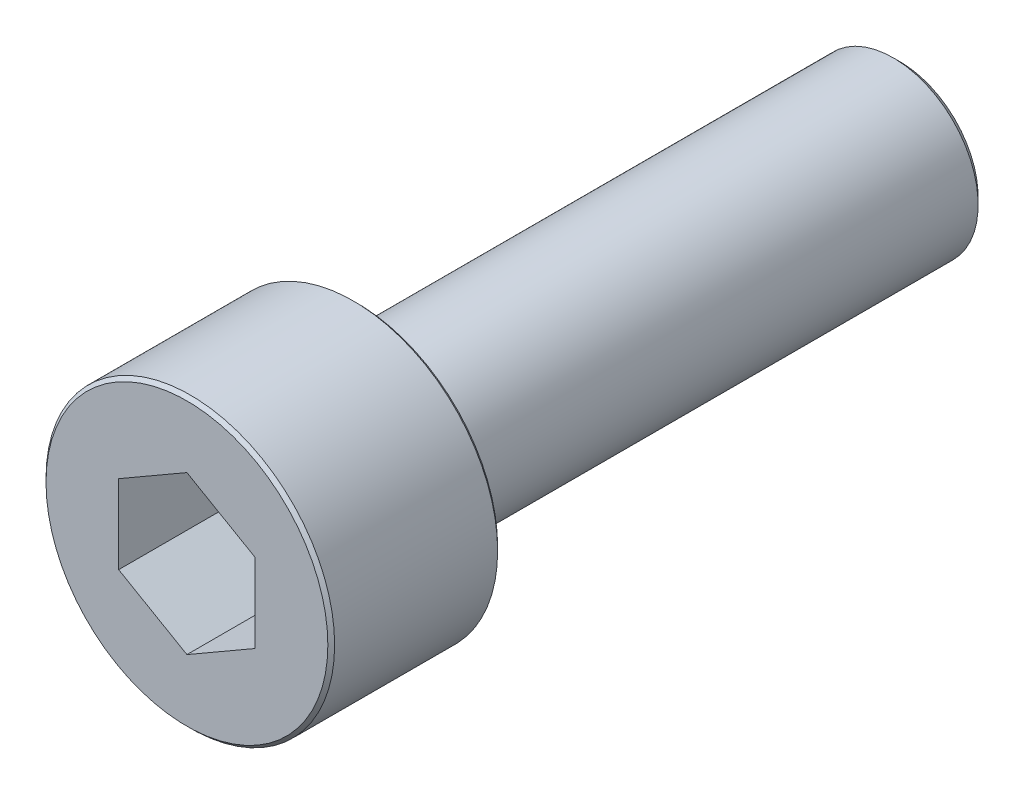
ISO-10303-21;
HEADER;
FILE_DESCRIPTION(('STEP AP214'),'2;1');
FILE_NAME('part.step','',(''),(''),'','','');
FILE_SCHEMA(('AUTOMOTIVE_DESIGN { 1 0 10303 214 1 1 1 1 }'));
ENDSEC;
DATA;
#1=APPLICATION_CONTEXT('core data for automotive mechanical design processes');
#2=APPLICATION_PROTOCOL_DEFINITION('international standard','automotive_design',2000,#1);
#3=PRODUCT_CONTEXT('',#1,'mechanical');
#4=PRODUCT('Part','Part','',(#3));
#5=PRODUCT_RELATED_PRODUCT_CATEGORY('part','',(#4));
#6=PRODUCT_DEFINITION_FORMATION('','',#4);
#7=PRODUCT_DEFINITION_CONTEXT('part definition',#1,'design');
#8=PRODUCT_DEFINITION('design','',#6,#7);
#9=PRODUCT_DEFINITION_SHAPE('','',#8);
#10=(LENGTH_UNIT() NAMED_UNIT(*) SI_UNIT(.MILLI.,.METRE.));
#11=(NAMED_UNIT(*) PLANE_ANGLE_UNIT() SI_UNIT($,.RADIAN.));
#12=(NAMED_UNIT(*) SI_UNIT($,.STERADIAN.) SOLID_ANGLE_UNIT());
#13=UNCERTAINTY_MEASURE_WITH_UNIT(LENGTH_MEASURE(1.E-05),#10,'distance_accuracy_value','');
#14=(GEOMETRIC_REPRESENTATION_CONTEXT(3) GLOBAL_UNCERTAINTY_ASSIGNED_CONTEXT((#13)) GLOBAL_UNIT_ASSIGNED_CONTEXT((#10,
#11,#12)) REPRESENTATION_CONTEXT('',''));
#15=CARTESIAN_POINT('',(0.,0.,0.));
#16=DIRECTION('',(0.,0.,1.));
#17=DIRECTION('',(1.,0.,0.));
#18=AXIS2_PLACEMENT_3D('',#15,#16,#17);
#19=CARTESIAN_POINT('',(0.,0.,16.));
#20=DIRECTION('',(0.,0.,1.));
#21=DIRECTION('',(1.,0.,0.));
#22=AXIS2_PLACEMENT_3D('',#19,#20,#21);
#23=CYLINDRICAL_SURFACE('',#22,4.25);
#24=CARTESIAN_POINT('',(0.,0.,16.0999997426841));
#25=DIRECTION('',(0.,0.,-1.));
#26=DIRECTION('',(-1.,0.,0.));
#27=AXIS2_PLACEMENT_3D('',#24,#25,#26);
#28=CIRCLE('',#27,4.25);
#29=CARTESIAN_POINT('',(-4.25,0.,16.0999997426841));
#30=VERTEX_POINT('',#29);
#31=EDGE_CURVE('E155',#30,#30,#28,.F.);
#32=ORIENTED_EDGE('',*,*,#31,.T.);
#33=EDGE_LOOP('',(#32));
#34=FACE_BOUND('',#33,.T.);
#35=CARTESIAN_POINT('',(0.,0.,20.9000003017667));
#36=DIRECTION('',(0.,0.,1.));
#37=DIRECTION('',(1.,0.,0.));
#38=AXIS2_PLACEMENT_3D('',#35,#36,#37);
#39=CIRCLE('',#38,4.25);
#40=CARTESIAN_POINT('',(4.25,0.,20.9000003017667));
#41=VERTEX_POINT('',#40);
#42=EDGE_CURVE('E152',#41,#41,#39,.F.);
#43=ORIENTED_EDGE('',*,*,#42,.T.);
#44=EDGE_LOOP('',(#43));
#45=FACE_BOUND('',#44,.T.);
#46=ADVANCED_FACE('F41',(#34,#45),#23,.T.);
#47=CARTESIAN_POINT('',(4.25,0.,16.));
#48=DIRECTION('',(0.,0.,-1.));
#49=DIRECTION('',(-1.,0.,0.));
#50=AXIS2_PLACEMENT_3D('',#47,#48,#49);
#51=PLANE('',#50);
#52=CARTESIAN_POINT('',(0.,0.,16.));
#53=DIRECTION('',(0.,0.,-1.));
#54=DIRECTION('',(-1.,0.,0.));
#55=AXIS2_PLACEMENT_3D('',#52,#53,#54);
#56=CIRCLE('',#55,4.15000030176672);
#57=CARTESIAN_POINT('',(-4.15000030176672,0.,16.));
#58=VERTEX_POINT('',#57);
#59=EDGE_CURVE('E158',#58,#58,#56,.T.);
#60=ORIENTED_EDGE('',*,*,#59,.T.);
#61=EDGE_LOOP('',(#60));
#62=FACE_BOUND('',#61,.T.);
#63=CARTESIAN_POINT('',(0.,0.,16.));
#64=DIRECTION('',(0.,0.,-1.));
#65=DIRECTION('',(-1.,0.,0.));
#66=AXIS2_PLACEMENT_3D('',#63,#64,#65);
#67=CIRCLE('',#66,2.5);
#68=CARTESIAN_POINT('',(-2.5,0.,16.));
#69=VERTEX_POINT('',#68);
#70=EDGE_CURVE('E144',#69,#69,#67,.T.);
#71=ORIENTED_EDGE('',*,*,#70,.F.);
#72=EDGE_LOOP('',(#71));
#73=FACE_BOUND('',#72,.T.);
#74=ADVANCED_FACE('F178',(#62,#73),#51,.T.);
#75=CARTESIAN_POINT('',(0.,0.,21.));
#76=DIRECTION('',(0.,0.,1.));
#77=DIRECTION('',(1.,0.,0.));
#78=AXIS2_PLACEMENT_3D('',#75,#76,#77);
#79=PLANE('',#78);
#80=CARTESIAN_POINT('',(0.,0.,21.));
#81=DIRECTION('',(0.,0.,1.));
#82=DIRECTION('',(1.,0.,0.));
#83=AXIS2_PLACEMENT_3D('',#80,#81,#82);
#84=CIRCLE('',#83,4.15000025731585);
#85=CARTESIAN_POINT('',(4.15000025731585,0.,21.));
#86=VERTEX_POINT('',#85);
#87=EDGE_CURVE('E161',#86,#86,#84,.T.);
#88=ORIENTED_EDGE('',*,*,#87,.T.);
#89=EDGE_LOOP('',(#88));
#90=FACE_BOUND('',#89,.T.);
#91=DIRECTION('',(0.,-1.,0.));
#92=VECTOR('',#91,1.);
#93=CARTESIAN_POINT('',(-2.00999999999998,1.16047404107096,21.));
#94=LINE('',#93,#92);
#95=CARTESIAN_POINT('',(-2.00999999999998,1.16047404107096,21.));
#96=VERTEX_POINT('',#95);
#97=CARTESIAN_POINT('',(-2.01,-1.160474041071,21.));
#98=VERTEX_POINT('',#97);
#99=EDGE_CURVE('E57',#96,#98,#94,.T.);
#100=ORIENTED_EDGE('',*,*,#99,.F.);
#101=DIRECTION('',(-0.866025403784436,-0.500000000000004,0.));
#102=VECTOR('',#101,1.);
#103=CARTESIAN_POINT('',(0.,2.32094808214212,21.));
#104=LINE('',#103,#102);
#105=CARTESIAN_POINT('',(0.,2.32094808214212,21.));
#106=VERTEX_POINT('',#105);
#107=EDGE_CURVE('E140',#106,#96,#104,.T.);
#108=ORIENTED_EDGE('',*,*,#107,.F.);
#109=DIRECTION('',(-0.866025403784428,0.500000000000018,0.));
#110=VECTOR('',#109,1.);
#111=CARTESIAN_POINT('',(2.0099999999999,1.16047404107098,21.));
#112=LINE('',#111,#110);
#113=CARTESIAN_POINT('',(2.0099999999999,1.16047404107098,21.));
#114=VERTEX_POINT('',#113);
#115=EDGE_CURVE('E138',#114,#106,#112,.T.);
#116=ORIENTED_EDGE('',*,*,#115,.F.);
#117=DIRECTION('',(0.,1.,0.));
#118=VECTOR('',#117,1.);
#119=CARTESIAN_POINT('',(2.0099999999999,-1.16047404107098,21.));
#120=LINE('',#119,#118);
#121=CARTESIAN_POINT('',(2.0099999999999,-1.16047404107098,21.));
#122=VERTEX_POINT('',#121);
#123=EDGE_CURVE('E105',#122,#114,#120,.T.);
#124=ORIENTED_EDGE('',*,*,#123,.F.);
#125=DIRECTION('',(0.866025403784439,0.5,0.));
#126=VECTOR('',#125,1.);
#127=CARTESIAN_POINT('',(0.,-2.32094808214211,21.));
#128=LINE('',#127,#126);
#129=CARTESIAN_POINT('',(0.,-2.32094808214211,21.));
#130=VERTEX_POINT('',#129);
#131=EDGE_CURVE('E134',#130,#122,#128,.T.);
#132=ORIENTED_EDGE('',*,*,#131,.F.);
#133=DIRECTION('',(0.866025403784439,-0.5,0.));
#134=VECTOR('',#133,1.);
#135=CARTESIAN_POINT('',(-2.01,-1.160474041071,21.));
#136=LINE('',#135,#134);
#137=EDGE_CURVE('E131',#98,#130,#136,.T.);
#138=ORIENTED_EDGE('',*,*,#137,.F.);
#139=EDGE_LOOP('',(#100,#108,#116,#124,#132,#138));
#140=FACE_BOUND('',#139,.T.);
#141=ADVANCED_FACE('F184',(#90,#140),#79,.T.);
#142=CARTESIAN_POINT('',(0.,0.,0.));
#143=DIRECTION('',(0.,0.,1.));
#144=DIRECTION('',(1.,0.,0.));
#145=AXIS2_PLACEMENT_3D('',#142,#143,#144);
#146=CYLINDRICAL_SURFACE('',#145,2.5);
#147=CARTESIAN_POINT('',(0.,0.,0.200004434784722));
#148=DIRECTION('',(0.,0.,-1.));
#149=DIRECTION('',(-1.,0.,0.));
#150=AXIS2_PLACEMENT_3D('',#147,#148,#149);
#151=CIRCLE('',#150,2.5);
#152=CARTESIAN_POINT('',(-2.5,0.,0.200004434784722));
#153=VERTEX_POINT('',#152);
#154=EDGE_CURVE('E11',#153,#153,#151,.F.);
#155=ORIENTED_EDGE('',*,*,#154,.T.);
#156=EDGE_LOOP('',(#155));
#157=FACE_BOUND('',#156,.T.);
#158=ORIENTED_EDGE('',*,*,#70,.T.);
#159=EDGE_LOOP('',(#158));
#160=FACE_BOUND('',#159,.T.);
#161=ADVANCED_FACE('F211',(#157,#160),#146,.T.);
#162=CARTESIAN_POINT('',(0.,0.,0.));
#163=DIRECTION('',(0.,0.,-1.));
#164=DIRECTION('',(-1.,0.,0.));
#165=AXIS2_PLACEMENT_3D('',#162,#163,#164);
#166=PLANE('',#165);
#167=CARTESIAN_POINT('',(0.,0.,0.));
#168=DIRECTION('',(0.,0.,-1.));
#169=DIRECTION('',(-1.,0.,0.));
#170=AXIS2_PLACEMENT_3D('',#167,#168,#169);
#171=CIRCLE('',#170,2.29999613337225);
#172=CARTESIAN_POINT('',(-2.29999613337225,0.,0.));
#173=VERTEX_POINT('',#172);
#174=EDGE_CURVE('E50',#173,#173,#171,.T.);
#175=ORIENTED_EDGE('',*,*,#174,.T.);
#176=EDGE_LOOP('',(#175));
#177=FACE_BOUND('',#176,.T.);
#178=ADVANCED_FACE('F166',(#177),#166,.T.);
#179=CARTESIAN_POINT('',(-2.00999999999998,1.16047404107096,17.25));
#180=DIRECTION('',(-1.,0.,0.));
#181=DIRECTION('',(0.,-1.,0.));
#182=AXIS2_PLACEMENT_3D('',#179,#180,#181);
#183=PLANE('',#182);
#184=ORIENTED_EDGE('',*,*,#99,.T.);
#185=DIRECTION('',(0.,0.,1.));
#186=VECTOR('',#185,1.);
#187=CARTESIAN_POINT('',(-2.01,-1.160474041071,17.25));
#188=LINE('',#187,#186);
#189=CARTESIAN_POINT('',(-2.01,-1.160474041071,17.25));
#190=VERTEX_POINT('',#189);
#191=EDGE_CURVE('E87',#190,#98,#188,.T.);
#192=ORIENTED_EDGE('',*,*,#191,.F.);
#193=DIRECTION('',(0.,-1.,0.));
#194=VECTOR('',#193,1.);
#195=CARTESIAN_POINT('',(-2.00999999999998,1.16047404107096,17.25));
#196=LINE('',#195,#194);
#197=CARTESIAN_POINT('',(-2.00999999999998,1.16047404107096,17.25));
#198=VERTEX_POINT('',#197);
#199=EDGE_CURVE('E142',#198,#190,#196,.T.);
#200=ORIENTED_EDGE('',*,*,#199,.F.);
#201=DIRECTION('',(0.,0.,1.));
#202=VECTOR('',#201,1.);
#203=CARTESIAN_POINT('',(-2.00999999999998,1.16047404107096,17.25));
#204=LINE('',#203,#202);
#205=EDGE_CURVE('E65',#198,#96,#204,.T.);
#206=ORIENTED_EDGE('',*,*,#205,.T.);
#207=EDGE_LOOP('',(#184,#192,#200,#206));
#208=FACE_BOUND('',#207,.T.);
#209=ADVANCED_FACE('F219',(#208),#183,.F.);
#210=CARTESIAN_POINT('',(0.,2.32094808214212,17.25));
#211=DIRECTION('',(-0.500000000000004,0.866025403784436,0.));
#212=DIRECTION('',(-0.866025403784436,-0.500000000000004,0.));
#213=AXIS2_PLACEMENT_3D('',#210,#211,#212);
#214=PLANE('',#213);
#215=ORIENTED_EDGE('',*,*,#107,.T.);
#216=ORIENTED_EDGE('',*,*,#205,.F.);
#217=DIRECTION('',(-0.866025403784436,-0.500000000000004,0.));
#218=VECTOR('',#217,1.);
#219=CARTESIAN_POINT('',(0.,2.32094808214212,17.25));
#220=LINE('',#219,#218);
#221=CARTESIAN_POINT('',(0.,2.32094808214212,17.25));
#222=VERTEX_POINT('',#221);
#223=EDGE_CURVE('E117',#222,#198,#220,.T.);
#224=ORIENTED_EDGE('',*,*,#223,.F.);
#225=DIRECTION('',(0.,0.,1.));
#226=VECTOR('',#225,1.);
#227=CARTESIAN_POINT('',(0.,2.32094808214212,17.25));
#228=LINE('',#227,#226);
#229=EDGE_CURVE('E109',#222,#106,#228,.T.);
#230=ORIENTED_EDGE('',*,*,#229,.T.);
#231=EDGE_LOOP('',(#215,#216,#224,#230));
#232=FACE_BOUND('',#231,.T.);
#233=ADVANCED_FACE('F225',(#232),#214,.F.);
#234=CARTESIAN_POINT('',(2.0099999999999,1.16047404107098,17.25));
#235=DIRECTION('',(0.500000000000018,0.866025403784428,0.));
#236=DIRECTION('',(-0.866025403784428,0.500000000000018,0.));
#237=AXIS2_PLACEMENT_3D('',#234,#235,#236);
#238=PLANE('',#237);
#239=ORIENTED_EDGE('',*,*,#115,.T.);
#240=ORIENTED_EDGE('',*,*,#229,.F.);
#241=DIRECTION('',(-0.866025403784428,0.500000000000018,0.));
#242=VECTOR('',#241,1.);
#243=CARTESIAN_POINT('',(2.0099999999999,1.16047404107098,17.25));
#244=LINE('',#243,#242);
#245=CARTESIAN_POINT('',(2.0099999999999,1.16047404107098,17.25));
#246=VERTEX_POINT('',#245);
#247=EDGE_CURVE('E113',#246,#222,#244,.T.);
#248=ORIENTED_EDGE('',*,*,#247,.F.);
#249=DIRECTION('',(0.,0.,1.));
#250=VECTOR('',#249,1.);
#251=CARTESIAN_POINT('',(2.0099999999999,1.16047404107098,17.25));
#252=LINE('',#251,#250);
#253=EDGE_CURVE('E98',#246,#114,#252,.T.);
#254=ORIENTED_EDGE('',*,*,#253,.T.);
#255=EDGE_LOOP('',(#239,#240,#248,#254));
#256=FACE_BOUND('',#255,.T.);
#257=ADVANCED_FACE('F114',(#256),#238,.F.);
#258=CARTESIAN_POINT('',(2.0099999999999,-1.16047404107098,17.25));
#259=DIRECTION('',(1.,0.,0.));
#260=DIRECTION('',(0.,0.,-1.));
#261=AXIS2_PLACEMENT_3D('',#258,#259,#260);
#262=PLANE('',#261);
#263=ORIENTED_EDGE('',*,*,#123,.T.);
#264=ORIENTED_EDGE('',*,*,#253,.F.);
#265=DIRECTION('',(0.,1.,0.));
#266=VECTOR('',#265,1.);
#267=CARTESIAN_POINT('',(2.0099999999999,-1.16047404107098,17.25));
#268=LINE('',#267,#266);
#269=CARTESIAN_POINT('',(2.0099999999999,-1.16047404107098,17.25));
#270=VERTEX_POINT('',#269);
#271=EDGE_CURVE('E102',#270,#246,#268,.T.);
#272=ORIENTED_EDGE('',*,*,#271,.F.);
#273=DIRECTION('',(0.,0.,1.));
#274=VECTOR('',#273,1.);
#275=CARTESIAN_POINT('',(2.0099999999999,-1.16047404107098,17.25));
#276=LINE('',#275,#274);
#277=EDGE_CURVE('E110',#270,#122,#276,.T.);
#278=ORIENTED_EDGE('',*,*,#277,.T.);
#279=EDGE_LOOP('',(#263,#264,#272,#278));
#280=FACE_BOUND('',#279,.T.);
#281=ADVANCED_FACE('F100',(#280),#262,.F.);
#282=CARTESIAN_POINT('',(0.,-2.32094808214211,17.25));
#283=DIRECTION('',(0.5,-0.866025403784438,0.));
#284=DIRECTION('',(0.866025403784439,0.5,0.));
#285=AXIS2_PLACEMENT_3D('',#282,#283,#284);
#286=PLANE('',#285);
#287=ORIENTED_EDGE('',*,*,#131,.T.);
#288=ORIENTED_EDGE('',*,*,#277,.F.);
#289=DIRECTION('',(0.866025403784439,0.5,0.));
#290=VECTOR('',#289,1.);
#291=CARTESIAN_POINT('',(0.,-2.32094808214211,17.25));
#292=LINE('',#291,#290);
#293=CARTESIAN_POINT('',(0.,-2.32094808214211,17.25));
#294=VERTEX_POINT('',#293);
#295=EDGE_CURVE('E123',#294,#270,#292,.T.);
#296=ORIENTED_EDGE('',*,*,#295,.F.);
#297=DIRECTION('',(0.,0.,1.));
#298=VECTOR('',#297,1.);
#299=CARTESIAN_POINT('',(0.,-2.32094808214211,17.25));
#300=LINE('',#299,#298);
#301=EDGE_CURVE('E147',#294,#130,#300,.T.);
#302=ORIENTED_EDGE('',*,*,#301,.T.);
#303=EDGE_LOOP('',(#287,#288,#296,#302));
#304=FACE_BOUND('',#303,.T.);
#305=ADVANCED_FACE('F228',(#304),#286,.F.);
#306=CARTESIAN_POINT('',(-2.01,-1.160474041071,17.25));
#307=DIRECTION('',(-0.5,-0.866025403784439,0.));
#308=DIRECTION('',(0.866025403784439,-0.5,0.));
#309=AXIS2_PLACEMENT_3D('',#306,#307,#308);
#310=PLANE('',#309);
#311=ORIENTED_EDGE('',*,*,#137,.T.);
#312=ORIENTED_EDGE('',*,*,#301,.F.);
#313=DIRECTION('',(0.866025403784439,-0.5,0.));
#314=VECTOR('',#313,1.);
#315=CARTESIAN_POINT('',(-2.01,-1.160474041071,17.25));
#316=LINE('',#315,#314);
#317=EDGE_CURVE('E125',#190,#294,#316,.T.);
#318=ORIENTED_EDGE('',*,*,#317,.F.);
#319=ORIENTED_EDGE('',*,*,#191,.T.);
#320=EDGE_LOOP('',(#311,#312,#318,#319));
#321=FACE_BOUND('',#320,.T.);
#322=ADVANCED_FACE('F203',(#321),#310,.F.);
#323=CARTESIAN_POINT('',(0.,0.,17.25));
#324=DIRECTION('',(0.,0.,1.));
#325=DIRECTION('',(1.,0.,0.));
#326=AXIS2_PLACEMENT_3D('',#323,#324,#325);
#327=PLANE('',#326);
#328=ORIENTED_EDGE('',*,*,#199,.T.);
#329=ORIENTED_EDGE('',*,*,#317,.T.);
#330=ORIENTED_EDGE('',*,*,#295,.T.);
#331=ORIENTED_EDGE('',*,*,#271,.T.);
#332=ORIENTED_EDGE('',*,*,#247,.T.);
#333=ORIENTED_EDGE('',*,*,#223,.T.);
#334=EDGE_LOOP('',(#328,#329,#330,#331,#332,#333));
#335=FACE_BOUND('',#334,.T.);
#336=ADVANCED_FACE('F120',(#335),#327,.T.);
#337=CARTESIAN_POINT('',(0.,0.,16.0999997426841));
#338=DIRECTION('',(0.,0.,1.));
#339=DIRECTION('',(1.,0.,0.));
#340=AXIS2_PLACEMENT_3D('',#337,#338,#339);
#341=CONICAL_SURFACE('',#340,4.25,0.785397941142494);
#342=ORIENTED_EDGE('',*,*,#59,.F.);
#343=EDGE_LOOP('',(#342));
#344=FACE_BOUND('',#343,.T.);
#345=ORIENTED_EDGE('',*,*,#31,.F.);
#346=EDGE_LOOP('',(#345));
#347=FACE_BOUND('',#346,.T.);
#348=ADVANCED_FACE('F174',(#344,#347),#341,.T.);
#349=CARTESIAN_POINT('',(0.,0.,21.));
#350=DIRECTION('',(0.,0.,-1.));
#351=DIRECTION('',(-1.,0.,0.));
#352=AXIS2_PLACEMENT_3D('',#349,#350,#351);
#353=CONICAL_SURFACE('',#352,4.15000025731585,0.785398385652394);
#354=ORIENTED_EDGE('',*,*,#42,.F.);
#355=EDGE_LOOP('',(#354));
#356=FACE_BOUND('',#355,.T.);
#357=ORIENTED_EDGE('',*,*,#87,.F.);
#358=EDGE_LOOP('',(#357));
#359=FACE_BOUND('',#358,.T.);
#360=ADVANCED_FACE('F169',(#356,#359),#353,.T.);
#361=CARTESIAN_POINT('',(0.,0.,0.));
#362=DIRECTION('',(0.,0.,1.));
#363=DIRECTION('',(1.,0.,0.));
#364=AXIS2_PLACEMENT_3D('',#361,#362,#363);
#365=CONICAL_SURFACE('',#364,2.29999613337225,0.785396743034501);
#366=ORIENTED_EDGE('',*,*,#154,.F.);
#367=EDGE_LOOP('',(#366));
#368=FACE_BOUND('',#367,.T.);
#369=ORIENTED_EDGE('',*,*,#174,.F.);
#370=EDGE_LOOP('',(#369));
#371=FACE_BOUND('',#370,.T.);
#372=ADVANCED_FACE('F44',(#368,#371),#365,.T.);
#373=CLOSED_SHELL('',(#46,#74,#141,#161,#178,#209,#233,#257,#281,#305,#322,#336,#348,#360,#372));
#374=MANIFOLD_SOLID_BREP('B2',#373);
#375=ADVANCED_BREP_SHAPE_REPRESENTATION('',(#18,#374),#14);
#376=SHAPE_DEFINITION_REPRESENTATION(#9,#375);
ENDSEC;
END-ISO-10303-21;
